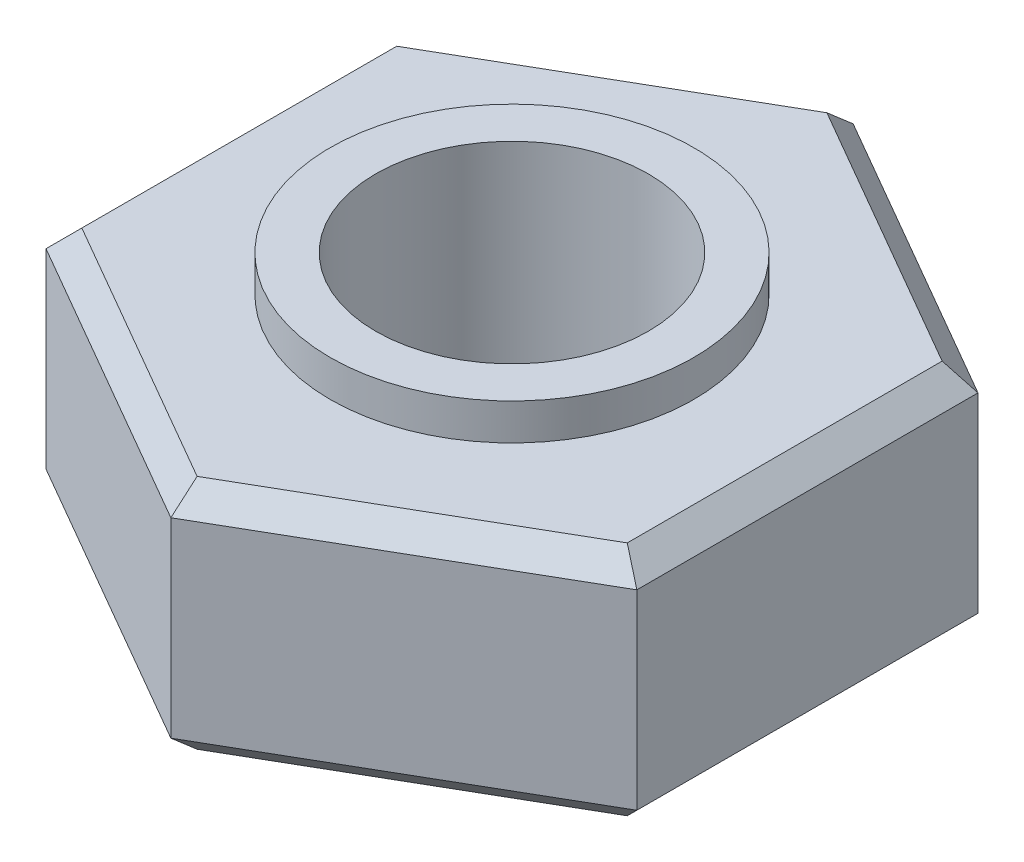
ISO-10303-21;
HEADER;
FILE_DESCRIPTION(('STEP AP214'),'2;1');
FILE_NAME('part.step','',(''),(''),'','','');
FILE_SCHEMA(('AUTOMOTIVE_DESIGN { 1 0 10303 214 1 1 1 1 }'));
ENDSEC;
DATA;
#1=APPLICATION_CONTEXT('core data for automotive mechanical design processes');
#2=APPLICATION_PROTOCOL_DEFINITION('international standard','automotive_design',2000,#1);
#3=PRODUCT_CONTEXT('',#1,'mechanical');
#4=PRODUCT('Part','Part','',(#3));
#5=PRODUCT_RELATED_PRODUCT_CATEGORY('part','',(#4));
#6=PRODUCT_DEFINITION_FORMATION('','',#4);
#7=PRODUCT_DEFINITION_CONTEXT('part definition',#1,'design');
#8=PRODUCT_DEFINITION('design','',#6,#7);
#9=PRODUCT_DEFINITION_SHAPE('','',#8);
#10=(LENGTH_UNIT() NAMED_UNIT(*) SI_UNIT(.MILLI.,.METRE.));
#11=(NAMED_UNIT(*) PLANE_ANGLE_UNIT() SI_UNIT($,.RADIAN.));
#12=(NAMED_UNIT(*) SI_UNIT($,.STERADIAN.) SOLID_ANGLE_UNIT());
#13=UNCERTAINTY_MEASURE_WITH_UNIT(LENGTH_MEASURE(1.E-05),#10,'distance_accuracy_value','');
#14=(GEOMETRIC_REPRESENTATION_CONTEXT(3) GLOBAL_UNCERTAINTY_ASSIGNED_CONTEXT((#13)) GLOBAL_UNIT_ASSIGNED_CONTEXT((#10,
#11,#12)) REPRESENTATION_CONTEXT('',''));
#15=CARTESIAN_POINT('',(0.,0.,0.));
#16=DIRECTION('',(0.,0.,1.));
#17=DIRECTION('',(1.,0.,0.));
#18=AXIS2_PLACEMENT_3D('',#15,#16,#17);
#19=CARTESIAN_POINT('',(0.,6.,0.));
#20=DIRECTION('',(0.,1.,0.));
#21=DIRECTION('',(0.,0.,1.));
#22=AXIS2_PLACEMENT_3D('',#19,#20,#21);
#23=PLANE('',#22);
#24=CARTESIAN_POINT('',(0.,6.,0.));
#25=DIRECTION('',(0.,1.,0.));
#26=DIRECTION('',(0.,0.,1.));
#27=AXIS2_PLACEMENT_3D('',#24,#25,#26);
#28=CIRCLE('',#27,3.);
#29=CARTESIAN_POINT('',(0.,6.,3.));
#30=VERTEX_POINT('',#29);
#31=EDGE_CURVE('E217',#30,#30,#28,.T.);
#32=ORIENTED_EDGE('',*,*,#31,.F.);
#33=EDGE_LOOP('',(#32));
#34=FACE_BOUND('',#33,.T.);
#35=CARTESIAN_POINT('',(0.,6.,0.));
#36=DIRECTION('',(0.,1.,0.));
#37=DIRECTION('',(0.,0.,1.));
#38=AXIS2_PLACEMENT_3D('',#35,#36,#37);
#39=CIRCLE('',#38,4.);
#40=CARTESIAN_POINT('',(0.,6.,4.));
#41=VERTEX_POINT('',#40);
#42=EDGE_CURVE('E203',#41,#41,#39,.T.);
#43=ORIENTED_EDGE('',*,*,#42,.T.);
#44=EDGE_LOOP('',(#43));
#45=FACE_BOUND('',#44,.T.);
#46=ADVANCED_FACE('F33',(#34,#45),#23,.T.);
#47=CARTESIAN_POINT('',(-6.49999999999996,6.,3.75277674973265));
#48=DIRECTION('',(0.499999999999995,0.,-0.866025403784441));
#49=DIRECTION('',(-0.866025403784441,0.,-0.499999999999995));
#50=AXIS2_PLACEMENT_3D('',#47,#48,#49);
#51=PLANE('',#50);
#52=DIRECTION('',(0.,-1.,0.));
#53=VECTOR('',#52,1.);
#54=CARTESIAN_POINT('',(-6.49999999999996,6.,3.75277674973265));
#55=LINE('',#54,#53);
#56=CARTESIAN_POINT('',(-6.49999999999996,4.7,3.75277674973265));
#57=VERTEX_POINT('',#56);
#58=CARTESIAN_POINT('',(-6.49999999999996,0.500000000000003,3.75277674973265));
#59=VERTEX_POINT('',#58);
#60=EDGE_CURVE('E130',#57,#59,#55,.T.);
#61=ORIENTED_EDGE('',*,*,#60,.T.);
#62=DIRECTION('',(0.866025403784441,0.,0.499999999999995));
#63=VECTOR('',#62,1.);
#64=CARTESIAN_POINT('',(-6.49999999999996,0.500000000000003,3.75277674973265));
#65=LINE('',#64,#63);
#66=CARTESIAN_POINT('',(0.,0.500000000000002,7.50555349946514));
#67=VERTEX_POINT('',#66);
#68=EDGE_CURVE('E256',#59,#67,#65,.T.);
#69=ORIENTED_EDGE('',*,*,#68,.T.);
#70=DIRECTION('',(0.,-1.,0.));
#71=VECTOR('',#70,1.);
#72=CARTESIAN_POINT('',(0.,6.,7.50555349946514));
#73=LINE('',#72,#71);
#74=CARTESIAN_POINT('',(0.,4.7,7.50555349946514));
#75=VERTEX_POINT('',#74);
#76=EDGE_CURVE('E136',#75,#67,#73,.T.);
#77=ORIENTED_EDGE('',*,*,#76,.F.);
#78=DIRECTION('',(-0.866025403784441,0.,-0.499999999999995));
#79=VECTOR('',#78,1.);
#80=CARTESIAN_POINT('',(-6.49999999999996,4.7,3.75277674973265));
#81=LINE('',#80,#79);
#82=EDGE_CURVE('E254',#75,#57,#81,.T.);
#83=ORIENTED_EDGE('',*,*,#82,.T.);
#84=EDGE_LOOP('',(#61,#69,#77,#83));
#85=FACE_BOUND('',#84,.T.);
#86=ADVANCED_FACE('F278',(#85),#51,.F.);
#87=CARTESIAN_POINT('',(0.,6.,7.50555349946514));
#88=DIRECTION('',(-0.500000000000001,0.,-0.866025403784438));
#89=DIRECTION('',(-0.866025403784438,0.,0.500000000000001));
#90=AXIS2_PLACEMENT_3D('',#87,#88,#89);
#91=PLANE('',#90);
#92=ORIENTED_EDGE('',*,*,#76,.T.);
#93=DIRECTION('',(0.866025403784438,0.,-0.500000000000001));
#94=VECTOR('',#93,1.);
#95=CARTESIAN_POINT('',(0.,0.500000000000002,7.50555349946514));
#96=LINE('',#95,#94);
#97=CARTESIAN_POINT('',(6.50000000000001,0.500000000000002,3.75277674973256));
#98=VERTEX_POINT('',#97);
#99=EDGE_CURVE('E260',#67,#98,#96,.T.);
#100=ORIENTED_EDGE('',*,*,#99,.T.);
#101=DIRECTION('',(0.,-1.,0.));
#102=VECTOR('',#101,1.);
#103=CARTESIAN_POINT('',(6.50000000000001,6.,3.75277674973256));
#104=LINE('',#103,#102);
#105=CARTESIAN_POINT('',(6.50000000000001,4.7,3.75277674973256));
#106=VERTEX_POINT('',#105);
#107=EDGE_CURVE('E227',#106,#98,#104,.T.);
#108=ORIENTED_EDGE('',*,*,#107,.F.);
#109=DIRECTION('',(-0.866025403784438,0.,0.500000000000001));
#110=VECTOR('',#109,1.);
#111=CARTESIAN_POINT('',(0.,4.7,7.50555349946514));
#112=LINE('',#111,#110);
#113=EDGE_CURVE('E258',#106,#75,#112,.T.);
#114=ORIENTED_EDGE('',*,*,#113,.T.);
#115=EDGE_LOOP('',(#92,#100,#108,#114));
#116=FACE_BOUND('',#115,.T.);
#117=ADVANCED_FACE('F280',(#116),#91,.F.);
#118=CARTESIAN_POINT('',(6.50000000000001,6.,3.75277674973256));
#119=DIRECTION('',(-1.,0.,0.));
#120=DIRECTION('',(0.,0.,1.));
#121=AXIS2_PLACEMENT_3D('',#118,#119,#120);
#122=PLANE('',#121);
#123=ORIENTED_EDGE('',*,*,#107,.T.);
#124=DIRECTION('',(0.,0.,-1.));
#125=VECTOR('',#124,1.);
#126=CARTESIAN_POINT('',(6.50000000000001,0.500000000000002,3.75277674973256));
#127=LINE('',#126,#125);
#128=CARTESIAN_POINT('',(6.49999999999999,0.500000000000002,-3.7527767497326));
#129=VERTEX_POINT('',#128);
#130=EDGE_CURVE('E252',#98,#129,#127,.T.);
#131=ORIENTED_EDGE('',*,*,#130,.T.);
#132=DIRECTION('',(0.,-1.,0.));
#133=VECTOR('',#132,1.);
#134=CARTESIAN_POINT('',(6.49999999999999,6.,-3.7527767497326));
#135=LINE('',#134,#133);
#136=CARTESIAN_POINT('',(6.49999999999999,4.7,-3.7527767497326));
#137=VERTEX_POINT('',#136);
#138=EDGE_CURVE('E224',#137,#129,#135,.T.);
#139=ORIENTED_EDGE('',*,*,#138,.F.);
#140=DIRECTION('',(0.,0.,1.));
#141=VECTOR('',#140,1.);
#142=CARTESIAN_POINT('',(6.50000000000001,4.7,3.75277674973256));
#143=LINE('',#142,#141);
#144=EDGE_CURVE('E250',#137,#106,#143,.T.);
#145=ORIENTED_EDGE('',*,*,#144,.T.);
#146=EDGE_LOOP('',(#123,#131,#139,#145));
#147=FACE_BOUND('',#146,.T.);
#148=ADVANCED_FACE('F304',(#147),#122,.F.);
#149=CARTESIAN_POINT('',(6.49999999999999,6.,-3.7527767497326));
#150=DIRECTION('',(-0.499999999999995,0.,0.866025403784441));
#151=DIRECTION('',(0.866025403784442,0.,0.499999999999995));
#152=AXIS2_PLACEMENT_3D('',#149,#150,#151);
#153=PLANE('',#152);
#154=ORIENTED_EDGE('',*,*,#138,.T.);
#155=DIRECTION('',(-0.866025403784442,0.,-0.499999999999995));
#156=VECTOR('',#155,1.);
#157=CARTESIAN_POINT('',(6.49999999999999,0.500000000000002,-3.7527767497326));
#158=LINE('',#157,#156);
#159=CARTESIAN_POINT('',(0.,0.500000000000002,-7.50555349946514));
#160=VERTEX_POINT('',#159);
#161=EDGE_CURVE('E248',#129,#160,#158,.T.);
#162=ORIENTED_EDGE('',*,*,#161,.T.);
#163=DIRECTION('',(0.,-1.,0.));
#164=VECTOR('',#163,1.);
#165=CARTESIAN_POINT('',(0.,6.,-7.50555349946514));
#166=LINE('',#165,#164);
#167=CARTESIAN_POINT('',(0.,4.7,-7.50555349946514));
#168=VERTEX_POINT('',#167);
#169=EDGE_CURVE('E147',#168,#160,#166,.T.);
#170=ORIENTED_EDGE('',*,*,#169,.F.);
#171=DIRECTION('',(0.866025403784442,0.,0.499999999999995));
#172=VECTOR('',#171,1.);
#173=CARTESIAN_POINT('',(6.49999999999999,4.7,-3.7527767497326));
#174=LINE('',#173,#172);
#175=EDGE_CURVE('E246',#168,#137,#174,.T.);
#176=ORIENTED_EDGE('',*,*,#175,.T.);
#177=EDGE_LOOP('',(#154,#162,#170,#176));
#178=FACE_BOUND('',#177,.T.);
#179=ADVANCED_FACE('F298',(#178),#153,.F.);
#180=CARTESIAN_POINT('',(0.,6.,-7.50555349946514));
#181=DIRECTION('',(0.500000000000007,0.,0.866025403784434));
#182=DIRECTION('',(0.866025403784435,0.,-0.500000000000007));
#183=AXIS2_PLACEMENT_3D('',#180,#181,#182);
#184=PLANE('',#183);
#185=ORIENTED_EDGE('',*,*,#169,.T.);
#186=DIRECTION('',(-0.866025403784435,0.,0.500000000000007));
#187=VECTOR('',#186,1.);
#188=CARTESIAN_POINT('',(0.,0.500000000000003,-7.50555349946514));
#189=LINE('',#188,#187);
#190=CARTESIAN_POINT('',(-6.50000000000004,0.500000000000003,-3.75277674973251));
#191=VERTEX_POINT('',#190);
#192=EDGE_CURVE('E146',#160,#191,#189,.T.);
#193=ORIENTED_EDGE('',*,*,#192,.T.);
#194=DIRECTION('',(0.,-1.,0.));
#195=VECTOR('',#194,1.);
#196=CARTESIAN_POINT('',(-6.50000000000004,6.,-3.75277674973251));
#197=LINE('',#196,#195);
#198=CARTESIAN_POINT('',(-6.50000000000004,4.7,-3.75277674973251));
#199=VERTEX_POINT('',#198);
#200=EDGE_CURVE('E127',#199,#191,#197,.T.);
#201=ORIENTED_EDGE('',*,*,#200,.F.);
#202=DIRECTION('',(0.866025403784435,0.,-0.500000000000007));
#203=VECTOR('',#202,1.);
#204=CARTESIAN_POINT('',(0.,4.7,-7.50555349946514));
#205=LINE('',#204,#203);
#206=EDGE_CURVE('E143',#199,#168,#205,.T.);
#207=ORIENTED_EDGE('',*,*,#206,.T.);
#208=EDGE_LOOP('',(#185,#193,#201,#207));
#209=FACE_BOUND('',#208,.T.);
#210=ADVANCED_FACE('F142',(#209),#184,.F.);
#211=CARTESIAN_POINT('',(-6.50000000000004,6.,-3.75277674973251));
#212=DIRECTION('',(1.,0.,0.));
#213=DIRECTION('',(0.,0.,-1.));
#214=AXIS2_PLACEMENT_3D('',#211,#212,#213);
#215=PLANE('',#214);
#216=ORIENTED_EDGE('',*,*,#200,.T.);
#217=DIRECTION('',(0.,0.,1.));
#218=VECTOR('',#217,1.);
#219=CARTESIAN_POINT('',(-6.50000000000004,0.500000000000002,-3.75277674973251));
#220=LINE('',#219,#218);
#221=EDGE_CURVE('E135',#191,#59,#220,.T.);
#222=ORIENTED_EDGE('',*,*,#221,.T.);
#223=ORIENTED_EDGE('',*,*,#60,.F.);
#224=DIRECTION('',(0.,0.,-1.));
#225=VECTOR('',#224,1.);
#226=CARTESIAN_POINT('',(-6.50000000000004,4.7,-3.75277674973251));
#227=LINE('',#226,#225);
#228=EDGE_CURVE('E123',#57,#199,#227,.T.);
#229=ORIENTED_EDGE('',*,*,#228,.T.);
#230=EDGE_LOOP('',(#216,#222,#223,#229));
#231=FACE_BOUND('',#230,.T.);
#232=ADVANCED_FACE('F125',(#231),#215,.F.);
#233=CARTESIAN_POINT('',(0.,0.,0.));
#234=DIRECTION('',(0.,1.,0.));
#235=DIRECTION('',(0.,0.,1.));
#236=AXIS2_PLACEMENT_3D('',#233,#234,#235);
#237=PLANE('',#236);
#238=DIRECTION('',(-0.866025403784441,0.,-0.499999999999995));
#239=VECTOR('',#238,1.);
#240=CARTESIAN_POINT('',(-2.99999999999998,0.,5.19615242270667));
#241=LINE('',#240,#239);
#242=CARTESIAN_POINT('',(0.,0.,6.92820323027551));
#243=VERTEX_POINT('',#242);
#244=CARTESIAN_POINT('',(-5.99999999999996,0.,3.46410161513783));
#245=VERTEX_POINT('',#244);
#246=EDGE_CURVE('E235',#243,#245,#241,.T.);
#247=ORIENTED_EDGE('',*,*,#246,.T.);
#248=DIRECTION('',(0.,0.,-1.));
#249=VECTOR('',#248,1.);
#250=CARTESIAN_POINT('',(-6.,0.,0.));
#251=LINE('',#250,#249);
#252=CARTESIAN_POINT('',(-6.00000000000003,0.,-3.4641016151377));
#253=VERTEX_POINT('',#252);
#254=EDGE_CURVE('E156',#245,#253,#251,.T.);
#255=ORIENTED_EDGE('',*,*,#254,.T.);
#256=DIRECTION('',(0.866025403784435,0.,-0.500000000000007));
#257=VECTOR('',#256,1.);
#258=CARTESIAN_POINT('',(-3.00000000000004,0.,-5.19615242270661));
#259=LINE('',#258,#257);
#260=CARTESIAN_POINT('',(0.,0.,-6.92820323027551));
#261=VERTEX_POINT('',#260);
#262=EDGE_CURVE('E241',#253,#261,#259,.T.);
#263=ORIENTED_EDGE('',*,*,#262,.T.);
#264=DIRECTION('',(0.866025403784442,0.,0.499999999999995));
#265=VECTOR('',#264,1.);
#266=CARTESIAN_POINT('',(2.99999999999997,0.,-5.19615242270664));
#267=LINE('',#266,#265);
#268=CARTESIAN_POINT('',(5.99999999999998,0.,-3.46410161513778));
#269=VERTEX_POINT('',#268);
#270=EDGE_CURVE('E239',#261,#269,#267,.T.);
#271=ORIENTED_EDGE('',*,*,#270,.T.);
#272=DIRECTION('',(0.,0.,1.));
#273=VECTOR('',#272,1.);
#274=CARTESIAN_POINT('',(6.,0.,0.));
#275=LINE('',#274,#273);
#276=CARTESIAN_POINT('',(6.00000000000001,0.,3.46410161513774));
#277=VERTEX_POINT('',#276);
#278=EDGE_CURVE('E237',#269,#277,#275,.T.);
#279=ORIENTED_EDGE('',*,*,#278,.T.);
#280=DIRECTION('',(-0.866025403784438,0.,0.500000000000001));
#281=VECTOR('',#280,1.);
#282=CARTESIAN_POINT('',(3.,0.,5.19615242270663));
#283=LINE('',#282,#281);
#284=EDGE_CURVE('E233',#277,#243,#283,.T.);
#285=ORIENTED_EDGE('',*,*,#284,.T.);
#286=EDGE_LOOP('',(#247,#255,#263,#271,#279,#285));
#287=FACE_BOUND('',#286,.T.);
#288=CARTESIAN_POINT('',(0.,0.,0.));
#289=DIRECTION('',(0.,1.,0.));
#290=DIRECTION('',(0.,0.,1.));
#291=AXIS2_PLACEMENT_3D('',#288,#289,#290);
#292=CIRCLE('',#291,3.);
#293=CARTESIAN_POINT('',(0.,0.,3.));
#294=VERTEX_POINT('',#293);
#295=EDGE_CURVE('E214',#294,#294,#292,.T.);
#296=ORIENTED_EDGE('',*,*,#295,.T.);
#297=EDGE_LOOP('',(#296));
#298=FACE_BOUND('',#297,.T.);
#299=ADVANCED_FACE('F288',(#287,#298),#237,.F.);
#300=CARTESIAN_POINT('',(0.,6.,0.));
#301=DIRECTION('',(0.,-1.,0.));
#302=DIRECTION('',(0.,0.,-1.));
#303=AXIS2_PLACEMENT_3D('',#300,#301,#302);
#304=CYLINDRICAL_SURFACE('',#303,3.);
#305=ORIENTED_EDGE('',*,*,#31,.T.);
#306=EDGE_LOOP('',(#305));
#307=FACE_BOUND('',#306,.T.);
#308=ORIENTED_EDGE('',*,*,#295,.F.);
#309=EDGE_LOOP('',(#308));
#310=FACE_BOUND('',#309,.T.);
#311=ADVANCED_FACE('F323',(#307,#310),#304,.F.);
#312=CARTESIAN_POINT('',(0.,5.2,0.));
#313=DIRECTION('',(0.,1.,0.));
#314=DIRECTION('',(0.,0.,1.));
#315=AXIS2_PLACEMENT_3D('',#312,#313,#314);
#316=PLANE('',#315);
#317=DIRECTION('',(-0.866025403784442,0.,-0.499999999999995));
#318=VECTOR('',#317,1.);
#319=CARTESIAN_POINT('',(-0.25000000000005,5.2,-7.07254079757292));
#320=LINE('',#319,#318);
#321=CARTESIAN_POINT('',(5.99999999999999,5.2,-3.46410161513778));
#322=VERTEX_POINT('',#321);
#323=CARTESIAN_POINT('',(0.,5.2,-6.92820323027552));
#324=VERTEX_POINT('',#323);
#325=EDGE_CURVE('E42',#322,#324,#320,.T.);
#326=ORIENTED_EDGE('',*,*,#325,.T.);
#327=DIRECTION('',(-0.866025403784435,0.,0.500000000000007));
#328=VECTOR('',#327,1.);
#329=CARTESIAN_POINT('',(-6.25000000000004,5.2,-3.31976404784029));
#330=LINE('',#329,#328);
#331=CARTESIAN_POINT('',(-6.00000000000004,5.2,-3.4641016151377));
#332=VERTEX_POINT('',#331);
#333=EDGE_CURVE('E11',#324,#332,#330,.T.);
#334=ORIENTED_EDGE('',*,*,#333,.T.);
#335=DIRECTION('',(0.,0.,1.));
#336=VECTOR('',#335,1.);
#337=CARTESIAN_POINT('',(-5.99999999999996,5.2,3.75277674973264));
#338=LINE('',#337,#336);
#339=CARTESIAN_POINT('',(-5.99999999999997,5.2,3.46410161513783));
#340=VERTEX_POINT('',#339);
#341=EDGE_CURVE('E159',#332,#340,#338,.T.);
#342=ORIENTED_EDGE('',*,*,#341,.T.);
#343=DIRECTION('',(0.866025403784441,0.,0.499999999999995));
#344=VECTOR('',#343,1.);
#345=CARTESIAN_POINT('',(0.249999999999997,5.2,7.07254079757292));
#346=LINE('',#345,#344);
#347=CARTESIAN_POINT('',(0.,5.2,6.92820323027552));
#348=VERTEX_POINT('',#347);
#349=EDGE_CURVE('E263',#340,#348,#346,.T.);
#350=ORIENTED_EDGE('',*,*,#349,.T.);
#351=DIRECTION('',(0.866025403784438,0.,-0.500000000000001));
#352=VECTOR('',#351,1.);
#353=CARTESIAN_POINT('',(6.25000000000002,5.2,3.31976404784034));
#354=LINE('',#353,#352);
#355=CARTESIAN_POINT('',(6.00000000000002,5.2,3.46410161513774));
#356=VERTEX_POINT('',#355);
#357=EDGE_CURVE('E265',#348,#356,#354,.T.);
#358=ORIENTED_EDGE('',*,*,#357,.T.);
#359=DIRECTION('',(0.,0.,-1.));
#360=VECTOR('',#359,1.);
#361=CARTESIAN_POINT('',(5.99999999999999,5.2,-3.7527767497326));
#362=LINE('',#361,#360);
#363=EDGE_CURVE('E53',#356,#322,#362,.T.);
#364=ORIENTED_EDGE('',*,*,#363,.T.);
#365=EDGE_LOOP('',(#326,#334,#342,#350,#358,#364));
#366=FACE_BOUND('',#365,.T.);
#367=CARTESIAN_POINT('',(0.,5.2,0.));
#368=DIRECTION('',(0.,1.,0.));
#369=DIRECTION('',(0.,0.,1.));
#370=AXIS2_PLACEMENT_3D('',#367,#368,#369);
#371=CIRCLE('',#370,4.);
#372=CARTESIAN_POINT('',(0.,5.2,4.));
#373=VERTEX_POINT('',#372);
#374=EDGE_CURVE('E209',#373,#373,#371,.T.);
#375=ORIENTED_EDGE('',*,*,#374,.F.);
#376=EDGE_LOOP('',(#375));
#377=FACE_BOUND('',#376,.T.);
#378=ADVANCED_FACE('F268',(#366,#377),#316,.T.);
#379=CARTESIAN_POINT('',(0.,5.2,0.));
#380=DIRECTION('',(0.,1.,0.));
#381=DIRECTION('',(0.,0.,1.));
#382=AXIS2_PLACEMENT_3D('',#379,#380,#381);
#383=CYLINDRICAL_SURFACE('',#382,4.);
#384=ORIENTED_EDGE('',*,*,#374,.T.);
#385=EDGE_LOOP('',(#384));
#386=FACE_BOUND('',#385,.T.);
#387=ORIENTED_EDGE('',*,*,#42,.F.);
#388=EDGE_LOOP('',(#387));
#389=FACE_BOUND('',#388,.T.);
#390=ADVANCED_FACE('F354',(#386,#389),#383,.T.);
#391=CARTESIAN_POINT('',(6.50000000000001,0.500000000000002,3.75277674973256));
#392=DIRECTION('',(-0.707106781186545,0.70710678118655,0.));
#393=DIRECTION('',(0.,0.,-1.));
#394=AXIS2_PLACEMENT_3D('',#391,#392,#393);
#395=PLANE('',#394);
#396=DIRECTION('',(0.65465367070798,0.654653670707975,0.377964473009227));
#397=VECTOR('',#396,1.);
#398=CARTESIAN_POINT('',(4.64285714285713,-1.35714285714286,2.68055482123753));
#399=LINE('',#398,#397);
#400=EDGE_CURVE('E196',#277,#98,#399,.T.);
#401=ORIENTED_EDGE('',*,*,#400,.F.);
#402=ORIENTED_EDGE('',*,*,#278,.F.);
#403=DIRECTION('',(0.654653670707977,0.654653670707974,-0.377964473009232));
#404=VECTOR('',#403,1.);
#405=CARTESIAN_POINT('',(4.64285714285711,-1.35714285714287,-2.68055482123756));
#406=LINE('',#405,#404);
#407=EDGE_CURVE('E164',#129,#269,#406,.F.);
#408=ORIENTED_EDGE('',*,*,#407,.F.);
#409=ORIENTED_EDGE('',*,*,#130,.F.);
#410=EDGE_LOOP('',(#401,#402,#408,#409));
#411=FACE_BOUND('',#410,.T.);
#412=ADVANCED_FACE('F303',(#411),#395,.F.);
#413=CARTESIAN_POINT('',(6.49999999999999,0.500000000000002,-3.7527767497326));
#414=DIRECTION('',(-0.353553390593269,0.70710678118655,0.612372435695794));
#415=DIRECTION('',(-0.866025403784442,0.,-0.499999999999995));
#416=AXIS2_PLACEMENT_3D('',#413,#414,#415);
#417=PLANE('',#416);
#418=ORIENTED_EDGE('',*,*,#407,.T.);
#419=ORIENTED_EDGE('',*,*,#270,.F.);
#420=DIRECTION('',(0.,0.654653670707975,-0.755928946018457));
#421=VECTOR('',#420,1.);
#422=CARTESIAN_POINT('',(0.,-1.35714285714285,-5.36110964247509));
#423=LINE('',#422,#421);
#424=EDGE_CURVE('E194',#160,#261,#423,.F.);
#425=ORIENTED_EDGE('',*,*,#424,.F.);
#426=ORIENTED_EDGE('',*,*,#161,.F.);
#427=EDGE_LOOP('',(#418,#419,#425,#426));
#428=FACE_BOUND('',#427,.T.);
#429=ADVANCED_FACE('F296',(#428),#417,.F.);
#430=CARTESIAN_POINT('',(0.,0.500000000000002,7.50555349946514));
#431=DIRECTION('',(-0.353553390593273,0.70710678118655,-0.612372435695792));
#432=DIRECTION('',(0.866025403784438,0.,-0.500000000000001));
#433=AXIS2_PLACEMENT_3D('',#430,#431,#432);
#434=PLANE('',#433);
#435=ORIENTED_EDGE('',*,*,#400,.T.);
#436=ORIENTED_EDGE('',*,*,#99,.F.);
#437=DIRECTION('',(0.,-0.654653670707975,-0.755928946018456));
#438=VECTOR('',#437,1.);
#439=CARTESIAN_POINT('',(0.,0.500000000000002,7.50555349946514));
#440=LINE('',#439,#438);
#441=EDGE_CURVE('E188',#243,#67,#440,.F.);
#442=ORIENTED_EDGE('',*,*,#441,.F.);
#443=ORIENTED_EDGE('',*,*,#284,.F.);
#444=EDGE_LOOP('',(#435,#436,#442,#443));
#445=FACE_BOUND('',#444,.T.);
#446=ADVANCED_FACE('F283',(#445),#434,.F.);
#447=CARTESIAN_POINT('',(0.,0.500000000000002,-7.50555349946514));
#448=DIRECTION('',(0.353553390593278,0.707106781186549,0.61237243569579));
#449=DIRECTION('',(-0.866025403784435,0.,0.500000000000007));
#450=AXIS2_PLACEMENT_3D('',#447,#448,#449);
#451=PLANE('',#450);
#452=ORIENTED_EDGE('',*,*,#424,.T.);
#453=ORIENTED_EDGE('',*,*,#262,.F.);
#454=DIRECTION('',(-0.654653670707982,0.654653670707975,-0.377964473009222));
#455=VECTOR('',#454,1.);
#456=CARTESIAN_POINT('',(-4.64285714285716,-1.35714285714286,-2.6805548212375));
#457=LINE('',#456,#455);
#458=EDGE_CURVE('E181',#191,#253,#457,.F.);
#459=ORIENTED_EDGE('',*,*,#458,.F.);
#460=ORIENTED_EDGE('',*,*,#192,.F.);
#461=EDGE_LOOP('',(#452,#453,#459,#460));
#462=FACE_BOUND('',#461,.T.);
#463=ADVANCED_FACE('F293',(#462),#451,.F.);
#464=CARTESIAN_POINT('',(-6.49999999999996,0.500000000000002,3.75277674973265));
#465=DIRECTION('',(0.353553390593269,0.707106781186549,-0.612372435695795));
#466=DIRECTION('',(0.866025403784441,0.,0.499999999999995));
#467=AXIS2_PLACEMENT_3D('',#464,#465,#466);
#468=PLANE('',#467);
#469=ORIENTED_EDGE('',*,*,#441,.T.);
#470=ORIENTED_EDGE('',*,*,#68,.F.);
#471=DIRECTION('',(0.654653670707975,-0.654653670707976,-0.377964473009234));
#472=VECTOR('',#471,1.);
#473=CARTESIAN_POINT('',(-6.49999999999996,0.500000000000002,3.75277674973265));
#474=LINE('',#473,#472);
#475=EDGE_CURVE('E177',#245,#59,#474,.F.);
#476=ORIENTED_EDGE('',*,*,#475,.F.);
#477=ORIENTED_EDGE('',*,*,#246,.F.);
#478=EDGE_LOOP('',(#469,#470,#476,#477));
#479=FACE_BOUND('',#478,.T.);
#480=ADVANCED_FACE('F286',(#479),#468,.F.);
#481=CARTESIAN_POINT('',(-6.50000000000004,0.500000000000002,-3.75277674973251));
#482=DIRECTION('',(0.707106781186546,0.707106781186549,0.));
#483=DIRECTION('',(0.,0.,1.));
#484=AXIS2_PLACEMENT_3D('',#481,#482,#483);
#485=PLANE('',#484);
#486=ORIENTED_EDGE('',*,*,#458,.T.);
#487=ORIENTED_EDGE('',*,*,#254,.F.);
#488=ORIENTED_EDGE('',*,*,#475,.T.);
#489=ORIENTED_EDGE('',*,*,#221,.F.);
#490=EDGE_LOOP('',(#486,#487,#488,#489));
#491=FACE_BOUND('',#490,.T.);
#492=ADVANCED_FACE('F290',(#491),#485,.F.);
#493=CARTESIAN_POINT('',(3.00000000000001,5.2,5.19615242270663));
#494=DIRECTION('',(0.353553390593275,0.707106781186545,0.612372435695796));
#495=DIRECTION('',(-0.866025403784438,0.,0.500000000000001));
#496=AXIS2_PLACEMENT_3D('',#493,#494,#495);
#497=PLANE('',#496);
#498=DIRECTION('',(0.,0.65465367070798,-0.755928946018452));
#499=VECTOR('',#498,1.);
#500=CARTESIAN_POINT('',(0.,6.05714285714285,5.93845991166475));
#501=LINE('',#500,#499);
#502=EDGE_CURVE('E170',#75,#348,#501,.T.);
#503=ORIENTED_EDGE('',*,*,#502,.F.);
#504=ORIENTED_EDGE('',*,*,#113,.F.);
#505=DIRECTION('',(-0.654653670707976,0.65465367070798,-0.377964473009225));
#506=VECTOR('',#505,1.);
#507=CARTESIAN_POINT('',(5.14285714285716,6.05714285714286,2.96922995583235));
#508=LINE('',#507,#506);
#509=EDGE_CURVE('E37',#356,#106,#508,.F.);
#510=ORIENTED_EDGE('',*,*,#509,.F.);
#511=ORIENTED_EDGE('',*,*,#357,.F.);
#512=EDGE_LOOP('',(#503,#504,#510,#511));
#513=FACE_BOUND('',#512,.T.);
#514=ADVANCED_FACE('F35',(#513),#497,.T.);
#515=CARTESIAN_POINT('',(6.,5.2,0.));
#516=DIRECTION('',(0.70710678118655,0.707106781186545,0.));
#517=DIRECTION('',(0.,0.,1.));
#518=AXIS2_PLACEMENT_3D('',#515,#516,#517);
#519=PLANE('',#518);
#520=ORIENTED_EDGE('',*,*,#509,.T.);
#521=ORIENTED_EDGE('',*,*,#144,.F.);
#522=DIRECTION('',(-0.654653670707973,0.654653670707979,0.377964473009231));
#523=VECTOR('',#522,1.);
#524=CARTESIAN_POINT('',(5.14285714285713,6.05714285714286,-2.96922995583238));
#525=LINE('',#524,#523);
#526=EDGE_CURVE('E168',#322,#137,#525,.F.);
#527=ORIENTED_EDGE('',*,*,#526,.F.);
#528=ORIENTED_EDGE('',*,*,#363,.F.);
#529=EDGE_LOOP('',(#520,#521,#527,#528));
#530=FACE_BOUND('',#529,.T.);
#531=ADVANCED_FACE('F272',(#530),#519,.T.);
#532=CARTESIAN_POINT('',(-2.99999999999998,5.2,5.19615242270667));
#533=DIRECTION('',(-0.353553390593271,0.707106781186545,0.612372435695799));
#534=DIRECTION('',(-0.866025403784441,0.,-0.499999999999995));
#535=AXIS2_PLACEMENT_3D('',#532,#533,#534);
#536=PLANE('',#535);
#537=ORIENTED_EDGE('',*,*,#502,.T.);
#538=ORIENTED_EDGE('',*,*,#349,.F.);
#539=DIRECTION('',(0.654653670707971,0.654653670707981,-0.377964473009232));
#540=VECTOR('',#539,1.);
#541=CARTESIAN_POINT('',(-5.14285714285712,6.05714285714286,2.96922995583243));
#542=LINE('',#541,#540);
#543=EDGE_CURVE('E161',#57,#340,#542,.T.);
#544=ORIENTED_EDGE('',*,*,#543,.F.);
#545=ORIENTED_EDGE('',*,*,#82,.F.);
#546=EDGE_LOOP('',(#537,#538,#544,#545));
#547=FACE_BOUND('',#546,.T.);
#548=ADVANCED_FACE('F275',(#547),#536,.T.);
#549=CARTESIAN_POINT('',(2.99999999999997,5.2,-5.19615242270665));
#550=DIRECTION('',(0.353553390593271,0.707106781186546,-0.612372435695798));
#551=DIRECTION('',(0.866025403784442,0.,0.499999999999995));
#552=AXIS2_PLACEMENT_3D('',#549,#550,#551);
#553=PLANE('',#552);
#554=ORIENTED_EDGE('',*,*,#526,.T.);
#555=ORIENTED_EDGE('',*,*,#175,.F.);
#556=DIRECTION('',(0.,0.654653670707979,0.755928946018453));
#557=VECTOR('',#556,1.);
#558=CARTESIAN_POINT('',(0.,6.05714285714286,-5.93845991166473));
#559=LINE('',#558,#557);
#560=EDGE_CURVE('E154',#324,#168,#559,.F.);
#561=ORIENTED_EDGE('',*,*,#560,.F.);
#562=ORIENTED_EDGE('',*,*,#325,.F.);
#563=EDGE_LOOP('',(#554,#555,#561,#562));
#564=FACE_BOUND('',#563,.T.);
#565=ADVANCED_FACE('F274',(#564),#553,.T.);
#566=CARTESIAN_POINT('',(-6.,5.2,0.));
#567=DIRECTION('',(-0.707106781186551,0.707106781186544,0.));
#568=DIRECTION('',(0.,0.,-1.));
#569=AXIS2_PLACEMENT_3D('',#566,#567,#568);
#570=PLANE('',#569);
#571=ORIENTED_EDGE('',*,*,#543,.T.);
#572=ORIENTED_EDGE('',*,*,#341,.F.);
#573=DIRECTION('',(-0.654653670707978,-0.65465367070798,-0.377964473009221));
#574=VECTOR('',#573,1.);
#575=CARTESIAN_POINT('',(-5.14285714285718,6.05714285714286,-2.96922995583231));
#576=LINE('',#575,#574);
#577=EDGE_CURVE('E152',#199,#332,#576,.F.);
#578=ORIENTED_EDGE('',*,*,#577,.F.);
#579=ORIENTED_EDGE('',*,*,#228,.F.);
#580=EDGE_LOOP('',(#571,#572,#578,#579));
#581=FACE_BOUND('',#580,.T.);
#582=ADVANCED_FACE('F158',(#581),#570,.T.);
#583=CARTESIAN_POINT('',(-3.00000000000004,5.2,-5.19615242270661));
#584=DIRECTION('',(-0.35355339059328,0.707106781186545,-0.612372435695794));
#585=DIRECTION('',(0.866025403784435,0.,-0.500000000000007));
#586=AXIS2_PLACEMENT_3D('',#583,#584,#585);
#587=PLANE('',#586);
#588=ORIENTED_EDGE('',*,*,#560,.T.);
#589=ORIENTED_EDGE('',*,*,#206,.F.);
#590=ORIENTED_EDGE('',*,*,#577,.T.);
#591=ORIENTED_EDGE('',*,*,#333,.F.);
#592=EDGE_LOOP('',(#588,#589,#590,#591));
#593=FACE_BOUND('',#592,.T.);
#594=ADVANCED_FACE('F150',(#593),#587,.T.);
#595=CLOSED_SHELL('',(#46,#86,#117,#148,#179,#210,#232,#299,#311,#378,#390,#412,#429,#446,#463,
#480,#492,#514,#531,#548,#565,#582,#594));
#596=MANIFOLD_SOLID_BREP('B2',#595);
#597=ADVANCED_BREP_SHAPE_REPRESENTATION('',(#18,#596),#14);
#598=SHAPE_DEFINITION_REPRESENTATION(#9,#597);
ENDSEC;
END-ISO-10303-21;
